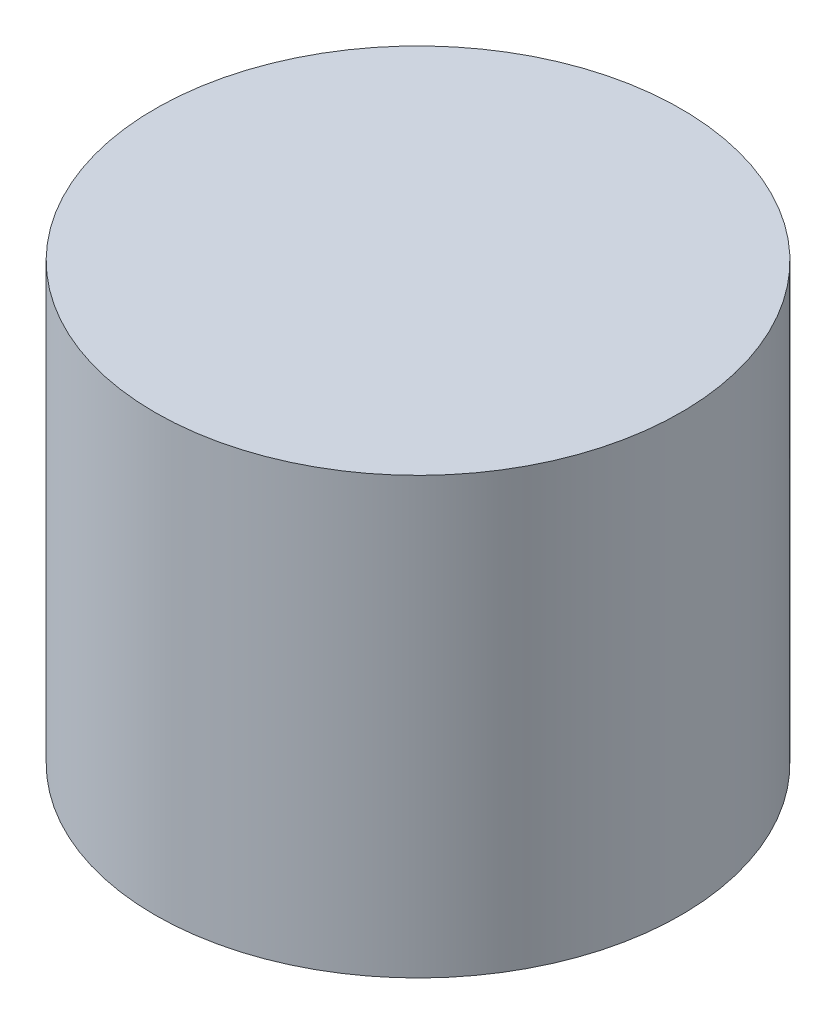
ISO-10303-21;
HEADER;
FILE_DESCRIPTION(('STEP AP214'),'2;1');
FILE_NAME('part.step','',(''),(''),'','','');
FILE_SCHEMA(('AUTOMOTIVE_DESIGN { 1 0 10303 214 1 1 1 1 }'));
ENDSEC;
DATA;
#1=APPLICATION_CONTEXT('core data for automotive mechanical design processes');
#2=APPLICATION_PROTOCOL_DEFINITION('international standard','automotive_design',2000,#1);
#3=PRODUCT_CONTEXT('',#1,'mechanical');
#4=PRODUCT('Part','Part','',(#3));
#5=PRODUCT_RELATED_PRODUCT_CATEGORY('part','',(#4));
#6=PRODUCT_DEFINITION_FORMATION('','',#4);
#7=PRODUCT_DEFINITION_CONTEXT('part definition',#1,'design');
#8=PRODUCT_DEFINITION('design','',#6,#7);
#9=PRODUCT_DEFINITION_SHAPE('','',#8);
#10=(LENGTH_UNIT() NAMED_UNIT(*) SI_UNIT(.MILLI.,.METRE.));
#11=(NAMED_UNIT(*) PLANE_ANGLE_UNIT() SI_UNIT($,.RADIAN.));
#12=(NAMED_UNIT(*) SI_UNIT($,.STERADIAN.) SOLID_ANGLE_UNIT());
#13=UNCERTAINTY_MEASURE_WITH_UNIT(LENGTH_MEASURE(1.E-05),#10,'distance_accuracy_value','');
#14=(GEOMETRIC_REPRESENTATION_CONTEXT(3) GLOBAL_UNCERTAINTY_ASSIGNED_CONTEXT((#13)) GLOBAL_UNIT_ASSIGNED_CONTEXT((#10,
#11,#12)) REPRESENTATION_CONTEXT('',''));
#15=CARTESIAN_POINT('',(0.,0.,0.));
#16=DIRECTION('',(0.,0.,1.));
#17=DIRECTION('',(1.,0.,0.));
#18=AXIS2_PLACEMENT_3D('',#15,#16,#17);
#19=CARTESIAN_POINT('',(0.,4.8,0.));
#20=DIRECTION('',(0.,-1.,0.));
#21=DIRECTION('',(0.,0.,-1.));
#22=AXIS2_PLACEMENT_3D('',#19,#20,#21);
#23=CYLINDRICAL_SURFACE('',#22,2.9);
#24=CARTESIAN_POINT('',(0.,4.8,0.));
#25=DIRECTION('',(0.,1.,0.));
#26=DIRECTION('',(0.,0.,1.));
#27=AXIS2_PLACEMENT_3D('',#24,#25,#26);
#28=CIRCLE('',#27,2.9);
#29=CARTESIAN_POINT('',(0.,4.8,2.9));
#30=VERTEX_POINT('',#29);
#31=EDGE_CURVE('E10',#30,#30,#28,.T.);
#32=ORIENTED_EDGE('',*,*,#31,.F.);
#33=EDGE_LOOP('',(#32));
#34=FACE_BOUND('',#33,.T.);
#35=CARTESIAN_POINT('',(0.,0.,0.));
#36=DIRECTION('',(0.,1.,0.));
#37=DIRECTION('',(0.,0.,1.));
#38=AXIS2_PLACEMENT_3D('',#35,#36,#37);
#39=CIRCLE('',#38,2.9);
#40=CARTESIAN_POINT('',(0.,0.,2.9));
#41=VERTEX_POINT('',#40);
#42=EDGE_CURVE('E34',#41,#41,#39,.T.);
#43=ORIENTED_EDGE('',*,*,#42,.T.);
#44=EDGE_LOOP('',(#43));
#45=FACE_BOUND('',#44,.T.);
#46=ADVANCED_FACE('F31',(#34,#45),#23,.T.);
#47=CARTESIAN_POINT('',(0.,4.8,0.));
#48=DIRECTION('',(0.,1.,0.));
#49=DIRECTION('',(0.,0.,1.));
#50=AXIS2_PLACEMENT_3D('',#47,#48,#49);
#51=PLANE('',#50);
#52=ORIENTED_EDGE('',*,*,#31,.T.);
#53=EDGE_LOOP('',(#52));
#54=FACE_BOUND('',#53,.T.);
#55=ADVANCED_FACE('F46',(#54),#51,.T.);
#56=CARTESIAN_POINT('',(0.,0.,0.));
#57=DIRECTION('',(0.,1.,0.));
#58=DIRECTION('',(0.,0.,1.));
#59=AXIS2_PLACEMENT_3D('',#56,#57,#58);
#60=PLANE('',#59);
#61=ORIENTED_EDGE('',*,*,#42,.F.);
#62=EDGE_LOOP('',(#61));
#63=FACE_BOUND('',#62,.T.);
#64=ADVANCED_FACE('F44',(#63),#60,.F.);
#65=CLOSED_SHELL('',(#46,#55,#64));
#66=MANIFOLD_SOLID_BREP('B2',#65);
#67=ADVANCED_BREP_SHAPE_REPRESENTATION('',(#18,#66),#14);
#68=SHAPE_DEFINITION_REPRESENTATION(#9,#67);
ENDSEC;
END-ISO-10303-21;
